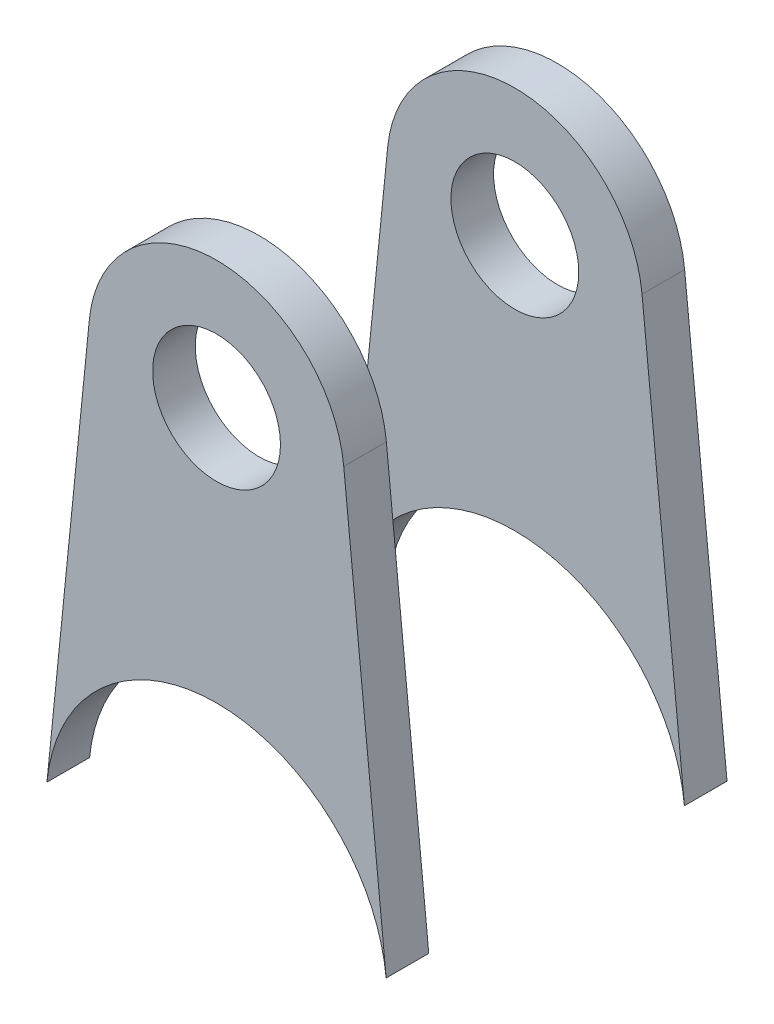
ISO-10303-21;
HEADER;
FILE_DESCRIPTION(('STEP AP214'),'2;1');
FILE_NAME('part.step','',(''),(''),'','','');
FILE_SCHEMA(('AUTOMOTIVE_DESIGN { 1 0 10303 214 1 1 1 1 }'));
ENDSEC;
DATA;
#1=APPLICATION_CONTEXT('core data for automotive mechanical design processes');
#2=APPLICATION_PROTOCOL_DEFINITION('international standard','automotive_design',2000,#1);
#3=PRODUCT_CONTEXT('',#1,'mechanical');
#4=PRODUCT('Part','Part','',(#3));
#5=PRODUCT_RELATED_PRODUCT_CATEGORY('part','',(#4));
#6=PRODUCT_DEFINITION_FORMATION('','',#4);
#7=PRODUCT_DEFINITION_CONTEXT('part definition',#1,'design');
#8=PRODUCT_DEFINITION('design','',#6,#7);
#9=PRODUCT_DEFINITION_SHAPE('','',#8);
#10=(LENGTH_UNIT() NAMED_UNIT(*) SI_UNIT(.MILLI.,.METRE.));
#11=(NAMED_UNIT(*) PLANE_ANGLE_UNIT() SI_UNIT($,.RADIAN.));
#12=(NAMED_UNIT(*) SI_UNIT($,.STERADIAN.) SOLID_ANGLE_UNIT());
#13=UNCERTAINTY_MEASURE_WITH_UNIT(LENGTH_MEASURE(1.E-05),#10,'distance_accuracy_value','');
#14=(GEOMETRIC_REPRESENTATION_CONTEXT(3) GLOBAL_UNCERTAINTY_ASSIGNED_CONTEXT((#13)) GLOBAL_UNIT_ASSIGNED_CONTEXT((#10,
#11,#12)) REPRESENTATION_CONTEXT('',''));
#15=CARTESIAN_POINT('',(0.,0.,0.));
#16=DIRECTION('',(0.,0.,1.));
#17=DIRECTION('',(1.,0.,0.));
#18=AXIS2_PLACEMENT_3D('',#15,#16,#17);
#19=CARTESIAN_POINT('',(-9.47725533844055,0.9525,-9.525));
#20=DIRECTION('',(0.99498743710662,-0.1,0.));
#21=DIRECTION('',(0.1,0.99498743710662,0.));
#22=AXIS2_PLACEMENT_3D('',#19,#20,#21);
#23=PLANE('',#22);
#24=DIRECTION('',(-0.1,-0.99498743710662,0.));
#25=VECTOR('',#24,1.);
#26=CARTESIAN_POINT('',(-9.47725533844055,0.9525,-12.7));
#27=LINE('',#26,#25);
#28=CARTESIAN_POINT('',(-9.47725533844055,0.952499999999998,-12.7));
#29=VERTEX_POINT('',#28);
#30=CARTESIAN_POINT('',(-12.6363404512541,-30.48,-12.7));
#31=VERTEX_POINT('',#30);
#32=EDGE_CURVE('E127',#29,#31,#27,.T.);
#33=ORIENTED_EDGE('',*,*,#32,.T.);
#34=DIRECTION('',(0.,0.,-1.));
#35=VECTOR('',#34,1.);
#36=CARTESIAN_POINT('',(-12.6363404512541,-30.48,-9.525));
#37=LINE('',#36,#35);
#38=CARTESIAN_POINT('',(-12.6363404512541,-30.48,-9.525));
#39=VERTEX_POINT('',#38);
#40=EDGE_CURVE('E12',#39,#31,#37,.T.);
#41=ORIENTED_EDGE('',*,*,#40,.F.);
#42=DIRECTION('',(-0.1,-0.99498743710662,0.));
#43=VECTOR('',#42,1.);
#44=CARTESIAN_POINT('',(-9.47725533844055,0.9525,-9.525));
#45=LINE('',#44,#43);
#46=CARTESIAN_POINT('',(-9.47725533844055,0.952499999999998,-9.525));
#47=VERTEX_POINT('',#46);
#48=EDGE_CURVE('E95',#47,#39,#45,.T.);
#49=ORIENTED_EDGE('',*,*,#48,.F.);
#50=DIRECTION('',(0.,0.,-1.));
#51=VECTOR('',#50,1.);
#52=CARTESIAN_POINT('',(-9.47725533844055,0.952499999999998,-9.525));
#53=LINE('',#52,#51);
#54=EDGE_CURVE('E126',#47,#29,#53,.T.);
#55=ORIENTED_EDGE('',*,*,#54,.T.);
#56=EDGE_LOOP('',(#33,#41,#49,#55));
#57=FACE_BOUND('',#56,.T.);
#58=ADVANCED_FACE('F55',(#57),#23,.F.);
#59=CARTESIAN_POINT('',(0.,-31.75,-9.525));
#60=DIRECTION('',(0.,0.,-1.));
#61=DIRECTION('',(-1.,0.,0.));
#62=AXIS2_PLACEMENT_3D('',#59,#60,#61);
#63=CYLINDRICAL_SURFACE('',#62,12.7);
#64=CARTESIAN_POINT('',(0.,-31.75,-12.7));
#65=DIRECTION('',(0.,0.,1.));
#66=DIRECTION('',(1.,0.,0.));
#67=AXIS2_PLACEMENT_3D('',#64,#65,#66);
#68=CIRCLE('',#67,12.7);
#69=CARTESIAN_POINT('',(12.6363404512541,-30.48,-12.7));
#70=VERTEX_POINT('',#69);
#71=EDGE_CURVE('E104',#70,#31,#68,.T.);
#72=ORIENTED_EDGE('',*,*,#71,.F.);
#73=DIRECTION('',(0.,0.,-1.));
#74=VECTOR('',#73,1.);
#75=CARTESIAN_POINT('',(12.6363404512541,-30.48,-9.525));
#76=LINE('',#75,#74);
#77=CARTESIAN_POINT('',(12.6363404512541,-30.48,-9.525));
#78=VERTEX_POINT('',#77);
#79=EDGE_CURVE('E64',#78,#70,#76,.T.);
#80=ORIENTED_EDGE('',*,*,#79,.F.);
#81=CARTESIAN_POINT('',(0.,-31.75,-9.525));
#82=DIRECTION('',(0.,0.,1.));
#83=DIRECTION('',(1.,0.,0.));
#84=AXIS2_PLACEMENT_3D('',#81,#82,#83);
#85=CIRCLE('',#84,12.7);
#86=EDGE_CURVE('E102',#78,#39,#85,.T.);
#87=ORIENTED_EDGE('',*,*,#86,.T.);
#88=ORIENTED_EDGE('',*,*,#40,.T.);
#89=EDGE_LOOP('',(#72,#80,#87,#88));
#90=FACE_BOUND('',#89,.T.);
#91=ADVANCED_FACE('F101',(#90),#63,.F.);
#92=CARTESIAN_POINT('',(9.47725533844055,0.952500000000002,-9.525));
#93=DIRECTION('',(0.99498743710662,0.1,0.));
#94=DIRECTION('',(-0.1,0.99498743710662,0.));
#95=AXIS2_PLACEMENT_3D('',#92,#93,#94);
#96=PLANE('',#95);
#97=DIRECTION('',(0.1,-0.99498743710662,0.));
#98=VECTOR('',#97,1.);
#99=CARTESIAN_POINT('',(9.47725533844055,0.952500000000002,-12.7));
#100=LINE('',#99,#98);
#101=CARTESIAN_POINT('',(9.47725533844055,0.952500000000001,-12.7));
#102=VERTEX_POINT('',#101);
#103=EDGE_CURVE('E133',#102,#70,#100,.T.);
#104=ORIENTED_EDGE('',*,*,#103,.F.);
#105=DIRECTION('',(0.,0.,-1.));
#106=VECTOR('',#105,1.);
#107=CARTESIAN_POINT('',(9.47725533844055,0.952500000000001,-9.525));
#108=LINE('',#107,#106);
#109=CARTESIAN_POINT('',(9.47725533844055,0.952500000000001,-9.525));
#110=VERTEX_POINT('',#109);
#111=EDGE_CURVE('E87',#110,#102,#108,.T.);
#112=ORIENTED_EDGE('',*,*,#111,.F.);
#113=DIRECTION('',(0.1,-0.99498743710662,0.));
#114=VECTOR('',#113,1.);
#115=CARTESIAN_POINT('',(9.47725533844055,0.952500000000002,-9.525));
#116=LINE('',#115,#114);
#117=EDGE_CURVE('E112',#110,#78,#116,.T.);
#118=ORIENTED_EDGE('',*,*,#117,.T.);
#119=ORIENTED_EDGE('',*,*,#79,.T.);
#120=EDGE_LOOP('',(#104,#112,#118,#119));
#121=FACE_BOUND('',#120,.T.);
#122=ADVANCED_FACE('F115',(#121),#96,.T.);
#123=CARTESIAN_POINT('',(0.,0.,-9.525));
#124=DIRECTION('',(0.,0.,-1.));
#125=DIRECTION('',(-1.,0.,0.));
#126=AXIS2_PLACEMENT_3D('',#123,#124,#125);
#127=CYLINDRICAL_SURFACE('',#126,9.525);
#128=CARTESIAN_POINT('',(0.,0.,-12.7));
#129=DIRECTION('',(0.,0.,1.));
#130=DIRECTION('',(1.,0.,0.));
#131=AXIS2_PLACEMENT_3D('',#128,#129,#130);
#132=CIRCLE('',#131,9.525);
#133=EDGE_CURVE('E90',#102,#29,#132,.T.);
#134=ORIENTED_EDGE('',*,*,#133,.T.);
#135=ORIENTED_EDGE('',*,*,#54,.F.);
#136=CARTESIAN_POINT('',(0.,0.,-9.525));
#137=DIRECTION('',(0.,0.,1.));
#138=DIRECTION('',(1.,0.,0.));
#139=AXIS2_PLACEMENT_3D('',#136,#137,#138);
#140=CIRCLE('',#139,9.525);
#141=EDGE_CURVE('E72',#110,#47,#140,.T.);
#142=ORIENTED_EDGE('',*,*,#141,.F.);
#143=ORIENTED_EDGE('',*,*,#111,.T.);
#144=EDGE_LOOP('',(#134,#135,#142,#143));
#145=FACE_BOUND('',#144,.T.);
#146=ADVANCED_FACE('F156',(#145),#127,.T.);
#147=CARTESIAN_POINT('',(0.,0.,-9.525));
#148=DIRECTION('',(0.,0.,-1.));
#149=DIRECTION('',(-1.,0.,0.));
#150=AXIS2_PLACEMENT_3D('',#147,#148,#149);
#151=CYLINDRICAL_SURFACE('',#150,4.7625);
#152=CARTESIAN_POINT('',(0.,0.,-9.525));
#153=DIRECTION('',(0.,0.,1.));
#154=DIRECTION('',(1.,0.,0.));
#155=AXIS2_PLACEMENT_3D('',#152,#153,#154);
#156=CIRCLE('',#155,4.7625);
#157=CARTESIAN_POINT('',(4.7625,0.,-9.525));
#158=VERTEX_POINT('',#157);
#159=EDGE_CURVE('E119',#158,#158,#156,.T.);
#160=ORIENTED_EDGE('',*,*,#159,.T.);
#161=EDGE_LOOP('',(#160));
#162=FACE_BOUND('',#161,.T.);
#163=CARTESIAN_POINT('',(0.,0.,-12.7));
#164=DIRECTION('',(0.,0.,1.));
#165=DIRECTION('',(1.,0.,0.));
#166=AXIS2_PLACEMENT_3D('',#163,#164,#165);
#167=CIRCLE('',#166,4.7625);
#168=CARTESIAN_POINT('',(4.7625,0.,-12.7));
#169=VERTEX_POINT('',#168);
#170=EDGE_CURVE('E138',#169,#169,#167,.T.);
#171=ORIENTED_EDGE('',*,*,#170,.F.);
#172=EDGE_LOOP('',(#171));
#173=FACE_BOUND('',#172,.T.);
#174=ADVANCED_FACE('F154',(#162,#173),#151,.F.);
#175=CARTESIAN_POINT('',(0.,0.,-9.525));
#176=DIRECTION('',(0.,0.,1.));
#177=DIRECTION('',(1.,0.,0.));
#178=AXIS2_PLACEMENT_3D('',#175,#176,#177);
#179=PLANE('',#178);
#180=ORIENTED_EDGE('',*,*,#48,.T.);
#181=ORIENTED_EDGE('',*,*,#86,.F.);
#182=ORIENTED_EDGE('',*,*,#117,.F.);
#183=ORIENTED_EDGE('',*,*,#141,.T.);
#184=EDGE_LOOP('',(#180,#181,#182,#183));
#185=FACE_BOUND('',#184,.T.);
#186=ORIENTED_EDGE('',*,*,#159,.F.);
#187=EDGE_LOOP('',(#186));
#188=FACE_BOUND('',#187,.T.);
#189=ADVANCED_FACE('F110',(#185,#188),#179,.T.);
#190=CARTESIAN_POINT('',(0.,0.,-12.7));
#191=DIRECTION('',(0.,0.,1.));
#192=DIRECTION('',(1.,0.,0.));
#193=AXIS2_PLACEMENT_3D('',#190,#191,#192);
#194=PLANE('',#193);
#195=ORIENTED_EDGE('',*,*,#32,.F.);
#196=ORIENTED_EDGE('',*,*,#133,.F.);
#197=ORIENTED_EDGE('',*,*,#103,.T.);
#198=ORIENTED_EDGE('',*,*,#71,.T.);
#199=EDGE_LOOP('',(#195,#196,#197,#198));
#200=FACE_BOUND('',#199,.T.);
#201=ORIENTED_EDGE('',*,*,#170,.T.);
#202=EDGE_LOOP('',(#201));
#203=FACE_BOUND('',#202,.T.);
#204=ADVANCED_FACE('F148',(#200,#203),#194,.F.);
#205=CLOSED_SHELL('',(#58,#91,#122,#146,#174,#189,#204));
#206=MANIFOLD_SOLID_BREP('B2',#205);
#207=CARTESIAN_POINT('',(-9.47725533844055,0.9525,9.525));
#208=DIRECTION('',(-0.99498743710662,0.1,0.));
#209=DIRECTION('',(-0.1,-0.99498743710662,0.));
#210=AXIS2_PLACEMENT_3D('',#207,#208,#209);
#211=PLANE('',#210);
#212=DIRECTION('',(-0.1,-0.99498743710662,0.));
#213=VECTOR('',#212,1.);
#214=CARTESIAN_POINT('',(-9.47725533844055,0.9525,12.7));
#215=LINE('',#214,#213);
#216=CARTESIAN_POINT('',(-9.47725533844055,0.952499999999998,12.7));
#217=VERTEX_POINT('',#216);
#218=CARTESIAN_POINT('',(-12.6363404512541,-30.48,12.7));
#219=VERTEX_POINT('',#218);
#220=EDGE_CURVE('E294',#217,#219,#215,.T.);
#221=ORIENTED_EDGE('',*,*,#220,.F.);
#222=DIRECTION('',(0.,0.,1.));
#223=VECTOR('',#222,1.);
#224=CARTESIAN_POINT('',(-9.47725533844055,0.952499999999998,9.525));
#225=LINE('',#224,#223);
#226=CARTESIAN_POINT('',(-9.47725533844055,0.952499999999998,9.525));
#227=VERTEX_POINT('',#226);
#228=EDGE_CURVE('E53',#227,#217,#225,.T.);
#229=ORIENTED_EDGE('',*,*,#228,.F.);
#230=DIRECTION('',(-0.1,-0.99498743710662,0.));
#231=VECTOR('',#230,1.);
#232=CARTESIAN_POINT('',(-9.47725533844055,0.9525,9.525));
#233=LINE('',#232,#231);
#234=CARTESIAN_POINT('',(-12.6363404512541,-30.48,9.525));
#235=VERTEX_POINT('',#234);
#236=EDGE_CURVE('E285',#227,#235,#233,.T.);
#237=ORIENTED_EDGE('',*,*,#236,.T.);
#238=DIRECTION('',(0.,0.,1.));
#239=VECTOR('',#238,1.);
#240=CARTESIAN_POINT('',(-12.6363404512541,-30.48,9.525));
#241=LINE('',#240,#239);
#242=EDGE_CURVE('E229',#235,#219,#241,.T.);
#243=ORIENTED_EDGE('',*,*,#242,.T.);
#244=EDGE_LOOP('',(#221,#229,#237,#243));
#245=FACE_BOUND('',#244,.T.);
#246=ADVANCED_FACE('F226',(#245),#211,.T.);
#247=CARTESIAN_POINT('',(0.,0.,9.525));
#248=DIRECTION('',(0.,0.,1.));
#249=DIRECTION('',(1.,0.,0.));
#250=AXIS2_PLACEMENT_3D('',#247,#248,#249);
#251=CYLINDRICAL_SURFACE('',#250,9.525);
#252=CARTESIAN_POINT('',(0.,0.,12.7));
#253=DIRECTION('',(0.,0.,1.));
#254=DIRECTION('',(1.,0.,0.));
#255=AXIS2_PLACEMENT_3D('',#252,#253,#254);
#256=CIRCLE('',#255,9.525);
#257=CARTESIAN_POINT('',(9.47725533844055,0.952500000000001,12.7));
#258=VERTEX_POINT('',#257);
#259=EDGE_CURVE('E300',#258,#217,#256,.T.);
#260=ORIENTED_EDGE('',*,*,#259,.F.);
#261=DIRECTION('',(0.,0.,1.));
#262=VECTOR('',#261,1.);
#263=CARTESIAN_POINT('',(9.47725533844055,0.952500000000001,9.525));
#264=LINE('',#263,#262);
#265=CARTESIAN_POINT('',(9.47725533844055,0.952500000000001,9.525));
#266=VERTEX_POINT('',#265);
#267=EDGE_CURVE('E235',#266,#258,#264,.T.);
#268=ORIENTED_EDGE('',*,*,#267,.F.);
#269=CARTESIAN_POINT('',(0.,0.,9.525));
#270=DIRECTION('',(0.,0.,1.));
#271=DIRECTION('',(1.,0.,0.));
#272=AXIS2_PLACEMENT_3D('',#269,#270,#271);
#273=CIRCLE('',#272,9.525);
#274=EDGE_CURVE('E275',#266,#227,#273,.T.);
#275=ORIENTED_EDGE('',*,*,#274,.T.);
#276=ORIENTED_EDGE('',*,*,#228,.T.);
#277=EDGE_LOOP('',(#260,#268,#275,#276));
#278=FACE_BOUND('',#277,.T.);
#279=ADVANCED_FACE('F319',(#278),#251,.T.);
#280=CARTESIAN_POINT('',(9.47725533844055,0.952500000000002,9.525));
#281=DIRECTION('',(-0.99498743710662,-0.1,0.));
#282=DIRECTION('',(0.1,-0.99498743710662,0.));
#283=AXIS2_PLACEMENT_3D('',#280,#281,#282);
#284=PLANE('',#283);
#285=DIRECTION('',(0.1,-0.99498743710662,0.));
#286=VECTOR('',#285,1.);
#287=CARTESIAN_POINT('',(9.47725533844055,0.952500000000002,12.7));
#288=LINE('',#287,#286);
#289=CARTESIAN_POINT('',(12.6363404512541,-30.48,12.7));
#290=VERTEX_POINT('',#289);
#291=EDGE_CURVE('E280',#258,#290,#288,.T.);
#292=ORIENTED_EDGE('',*,*,#291,.T.);
#293=DIRECTION('',(0.,0.,1.));
#294=VECTOR('',#293,1.);
#295=CARTESIAN_POINT('',(12.6363404512541,-30.48,9.525));
#296=LINE('',#295,#294);
#297=CARTESIAN_POINT('',(12.6363404512541,-30.48,9.525));
#298=VERTEX_POINT('',#297);
#299=EDGE_CURVE('E278',#298,#290,#296,.T.);
#300=ORIENTED_EDGE('',*,*,#299,.F.);
#301=DIRECTION('',(0.1,-0.99498743710662,0.));
#302=VECTOR('',#301,1.);
#303=CARTESIAN_POINT('',(9.47725533844055,0.952500000000002,9.525));
#304=LINE('',#303,#302);
#305=EDGE_CURVE('E271',#266,#298,#304,.T.);
#306=ORIENTED_EDGE('',*,*,#305,.F.);
#307=ORIENTED_EDGE('',*,*,#267,.T.);
#308=EDGE_LOOP('',(#292,#300,#306,#307));
#309=FACE_BOUND('',#308,.T.);
#310=ADVANCED_FACE('F279',(#309),#284,.F.);
#311=CARTESIAN_POINT('',(0.,-31.75,9.525));
#312=DIRECTION('',(0.,0.,1.));
#313=DIRECTION('',(1.,0.,0.));
#314=AXIS2_PLACEMENT_3D('',#311,#312,#313);
#315=CYLINDRICAL_SURFACE('',#314,12.7);
#316=CARTESIAN_POINT('',(0.,-31.75,12.7));
#317=DIRECTION('',(0.,0.,1.));
#318=DIRECTION('',(1.,0.,0.));
#319=AXIS2_PLACEMENT_3D('',#316,#317,#318);
#320=CIRCLE('',#319,12.7);
#321=EDGE_CURVE('E297',#290,#219,#320,.T.);
#322=ORIENTED_EDGE('',*,*,#321,.T.);
#323=ORIENTED_EDGE('',*,*,#242,.F.);
#324=CARTESIAN_POINT('',(0.,-31.75,9.525));
#325=DIRECTION('',(0.,0.,1.));
#326=DIRECTION('',(1.,0.,0.));
#327=AXIS2_PLACEMENT_3D('',#324,#325,#326);
#328=CIRCLE('',#327,12.7);
#329=EDGE_CURVE('E268',#298,#235,#328,.T.);
#330=ORIENTED_EDGE('',*,*,#329,.F.);
#331=ORIENTED_EDGE('',*,*,#299,.T.);
#332=EDGE_LOOP('',(#322,#323,#330,#331));
#333=FACE_BOUND('',#332,.T.);
#334=ADVANCED_FACE('F284',(#333),#315,.F.);
#335=CARTESIAN_POINT('',(0.,0.,9.525));
#336=DIRECTION('',(0.,0.,1.));
#337=DIRECTION('',(1.,0.,0.));
#338=AXIS2_PLACEMENT_3D('',#335,#336,#337);
#339=CYLINDRICAL_SURFACE('',#338,4.7625);
#340=CARTESIAN_POINT('',(0.,0.,9.525));
#341=DIRECTION('',(0.,0.,1.));
#342=DIRECTION('',(1.,0.,0.));
#343=AXIS2_PLACEMENT_3D('',#340,#341,#342);
#344=CIRCLE('',#343,4.7625);
#345=CARTESIAN_POINT('',(4.7625,0.,9.525));
#346=VERTEX_POINT('',#345);
#347=EDGE_CURVE('E291',#346,#346,#344,.T.);
#348=ORIENTED_EDGE('',*,*,#347,.F.);
#349=EDGE_LOOP('',(#348));
#350=FACE_BOUND('',#349,.T.);
#351=CARTESIAN_POINT('',(0.,0.,12.7));
#352=DIRECTION('',(0.,0.,1.));
#353=DIRECTION('',(1.,0.,0.));
#354=AXIS2_PLACEMENT_3D('',#351,#352,#353);
#355=CIRCLE('',#354,4.7625);
#356=CARTESIAN_POINT('',(4.7625,0.,12.7));
#357=VERTEX_POINT('',#356);
#358=EDGE_CURVE('E287',#357,#357,#355,.T.);
#359=ORIENTED_EDGE('',*,*,#358,.T.);
#360=EDGE_LOOP('',(#359));
#361=FACE_BOUND('',#360,.T.);
#362=ADVANCED_FACE('F307',(#350,#361),#339,.F.);
#363=CARTESIAN_POINT('',(0.,0.,9.525));
#364=DIRECTION('',(0.,0.,1.));
#365=DIRECTION('',(1.,0.,0.));
#366=AXIS2_PLACEMENT_3D('',#363,#364,#365);
#367=PLANE('',#366);
#368=ORIENTED_EDGE('',*,*,#236,.F.);
#369=ORIENTED_EDGE('',*,*,#274,.F.);
#370=ORIENTED_EDGE('',*,*,#305,.T.);
#371=ORIENTED_EDGE('',*,*,#329,.T.);
#372=EDGE_LOOP('',(#368,#369,#370,#371));
#373=FACE_BOUND('',#372,.T.);
#374=ORIENTED_EDGE('',*,*,#347,.T.);
#375=EDGE_LOOP('',(#374));
#376=FACE_BOUND('',#375,.T.);
#377=ADVANCED_FACE('F273',(#373,#376),#367,.F.);
#378=CARTESIAN_POINT('',(0.,0.,12.7));
#379=DIRECTION('',(0.,0.,1.));
#380=DIRECTION('',(1.,0.,0.));
#381=AXIS2_PLACEMENT_3D('',#378,#379,#380);
#382=PLANE('',#381);
#383=ORIENTED_EDGE('',*,*,#220,.T.);
#384=ORIENTED_EDGE('',*,*,#321,.F.);
#385=ORIENTED_EDGE('',*,*,#291,.F.);
#386=ORIENTED_EDGE('',*,*,#259,.T.);
#387=EDGE_LOOP('',(#383,#384,#385,#386));
#388=FACE_BOUND('',#387,.T.);
#389=ORIENTED_EDGE('',*,*,#358,.F.);
#390=EDGE_LOOP('',(#389));
#391=FACE_BOUND('',#390,.T.);
#392=ADVANCED_FACE('F309',(#388,#391),#382,.T.);
#393=CLOSED_SHELL('',(#246,#279,#310,#334,#362,#377,#392));
#394=MANIFOLD_SOLID_BREP('B6',#393);
#395=ADVANCED_BREP_SHAPE_REPRESENTATION('',(#18,#206,#394),#14);
#396=SHAPE_DEFINITION_REPRESENTATION(#9,#395);
ENDSEC;
END-ISO-10303-21;
